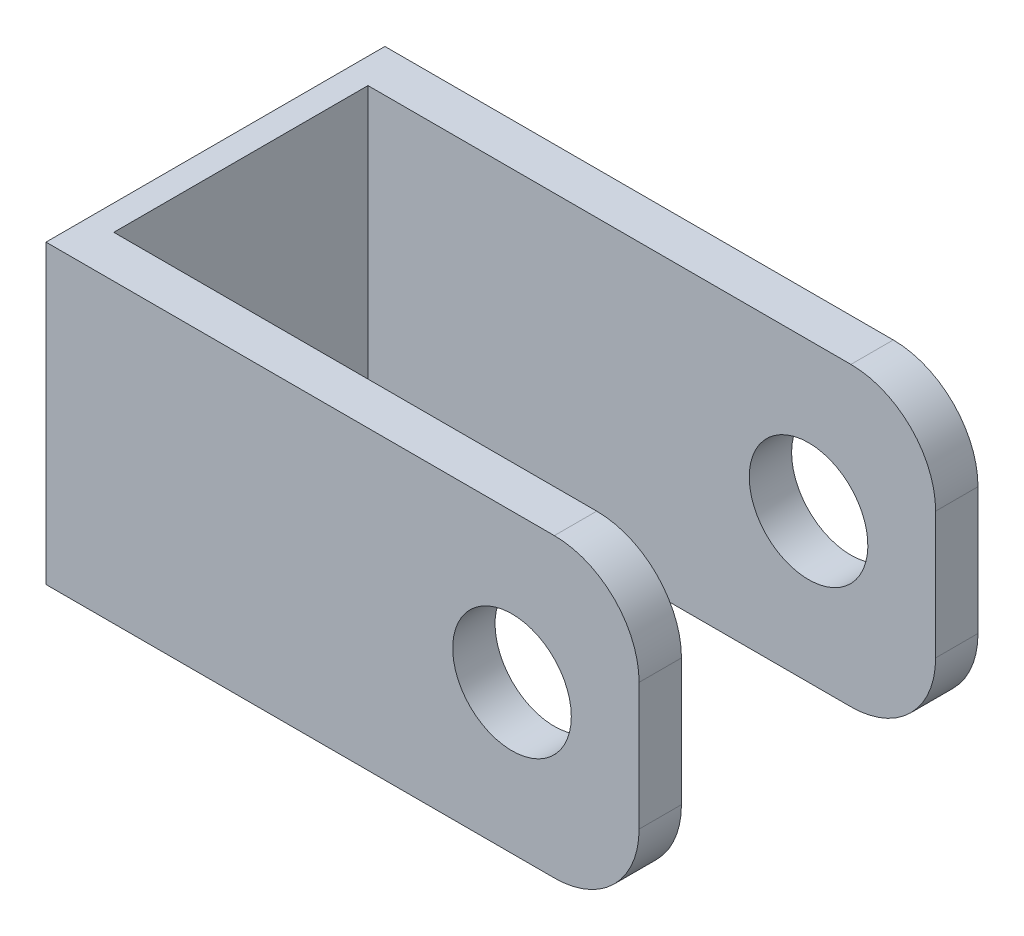
ISO-10303-21;
HEADER;
FILE_DESCRIPTION(('STEP AP214'),'2;1');
FILE_NAME('part.step','',(''),(''),'','','');
FILE_SCHEMA(('AUTOMOTIVE_DESIGN { 1 0 10303 214 1 1 1 1 }'));
ENDSEC;
DATA;
#1=APPLICATION_CONTEXT('core data for automotive mechanical design processes');
#2=APPLICATION_PROTOCOL_DEFINITION('international standard','automotive_design',2000,#1);
#3=PRODUCT_CONTEXT('',#1,'mechanical');
#4=PRODUCT('Part','Part','',(#3));
#5=PRODUCT_RELATED_PRODUCT_CATEGORY('part','',(#4));
#6=PRODUCT_DEFINITION_FORMATION('','',#4);
#7=PRODUCT_DEFINITION_CONTEXT('part definition',#1,'design');
#8=PRODUCT_DEFINITION('design','',#6,#7);
#9=PRODUCT_DEFINITION_SHAPE('','',#8);
#10=(LENGTH_UNIT() NAMED_UNIT(*) SI_UNIT(.MILLI.,.METRE.));
#11=(NAMED_UNIT(*) PLANE_ANGLE_UNIT() SI_UNIT($,.RADIAN.));
#12=(NAMED_UNIT(*) SI_UNIT($,.STERADIAN.) SOLID_ANGLE_UNIT());
#13=UNCERTAINTY_MEASURE_WITH_UNIT(LENGTH_MEASURE(1.E-05),#10,'distance_accuracy_value','');
#14=(GEOMETRIC_REPRESENTATION_CONTEXT(3) GLOBAL_UNCERTAINTY_ASSIGNED_CONTEXT((#13)) GLOBAL_UNIT_ASSIGNED_CONTEXT((#10,
#11,#12)) REPRESENTATION_CONTEXT('',''));
#15=CARTESIAN_POINT('',(0.,0.,0.));
#16=DIRECTION('',(0.,0.,1.));
#17=DIRECTION('',(1.,0.,0.));
#18=AXIS2_PLACEMENT_3D('',#15,#16,#17);
#19=CARTESIAN_POINT('',(3.,0.,0.));
#20=DIRECTION('',(1.,0.,0.));
#21=DIRECTION('',(0.,0.,-1.));
#22=AXIS2_PLACEMENT_3D('',#19,#20,#21);
#23=PLANE('',#22);
#24=DIRECTION('',(0.,0.,-1.));
#25=VECTOR('',#24,1.);
#26=CARTESIAN_POINT('',(3.,0.,0.));
#27=LINE('',#26,#25);
#28=CARTESIAN_POINT('',(3.,0.,35.));
#29=VERTEX_POINT('',#28);
#30=CARTESIAN_POINT('',(3.,0.,4.99999999999999));
#31=VERTEX_POINT('',#30);
#32=EDGE_CURVE('E131',#29,#31,#27,.T.);
#33=ORIENTED_EDGE('',*,*,#32,.T.);
#34=DIRECTION('',(0.,1.,0.));
#35=VECTOR('',#34,1.);
#36=CARTESIAN_POINT('',(3.,0.,4.99999999999999));
#37=LINE('',#36,#35);
#38=CARTESIAN_POINT('',(3.,35.,4.99999999999999));
#39=VERTEX_POINT('',#38);
#40=EDGE_CURVE('E139',#31,#39,#37,.T.);
#41=ORIENTED_EDGE('',*,*,#40,.T.);
#42=DIRECTION('',(0.,0.,1.));
#43=VECTOR('',#42,1.);
#44=CARTESIAN_POINT('',(3.,35.,0.));
#45=LINE('',#44,#43);
#46=CARTESIAN_POINT('',(3.,35.,35.));
#47=VERTEX_POINT('',#46);
#48=EDGE_CURVE('E152',#39,#47,#45,.T.);
#49=ORIENTED_EDGE('',*,*,#48,.T.);
#50=DIRECTION('',(0.,1.,0.));
#51=VECTOR('',#50,1.);
#52=CARTESIAN_POINT('',(3.,0.,35.));
#53=LINE('',#52,#51);
#54=EDGE_CURVE('E150',#29,#47,#53,.T.);
#55=ORIENTED_EDGE('',*,*,#54,.F.);
#56=EDGE_LOOP('',(#33,#41,#49,#55));
#57=FACE_BOUND('',#56,.T.);
#58=ADVANCED_FACE('F33',(#57),#23,.T.);
#59=CARTESIAN_POINT('',(3.,0.,0.));
#60=DIRECTION('',(0.,0.,1.));
#61=DIRECTION('',(0.,-1.,0.));
#62=AXIS2_PLACEMENT_3D('',#59,#60,#61);
#63=PLANE('',#62);
#64=CARTESIAN_POINT('',(55.,17.5,0.));
#65=DIRECTION('',(0.,0.,1.));
#66=DIRECTION('',(0.,-1.,0.));
#67=AXIS2_PLACEMENT_3D('',#64,#65,#66);
#68=CIRCLE('',#67,7.);
#69=CARTESIAN_POINT('',(55.,10.5,0.));
#70=VERTEX_POINT('',#69);
#71=EDGE_CURVE('E416',#70,#70,#68,.T.);
#72=ORIENTED_EDGE('',*,*,#71,.T.);
#73=EDGE_LOOP('',(#72));
#74=FACE_BOUND('',#73,.T.);
#75=DIRECTION('',(0.,-1.,0.));
#76=VECTOR('',#75,1.);
#77=CARTESIAN_POINT('',(70.,35.,0.));
#78=LINE('',#77,#76);
#79=CARTESIAN_POINT('',(70.,25.,0.));
#80=VERTEX_POINT('',#79);
#81=CARTESIAN_POINT('',(70.,10.,0.));
#82=VERTEX_POINT('',#81);
#83=EDGE_CURVE('E135',#80,#82,#78,.T.);
#84=ORIENTED_EDGE('',*,*,#83,.T.);
#85=CARTESIAN_POINT('',(60.,10.,0.));
#86=DIRECTION('',(0.,0.,1.));
#87=DIRECTION('',(0.,-1.,0.));
#88=AXIS2_PLACEMENT_3D('',#85,#86,#87);
#89=CIRCLE('',#88,10.);
#90=CARTESIAN_POINT('',(60.,0.,0.));
#91=VERTEX_POINT('',#90);
#92=EDGE_CURVE('E190',#82,#91,#89,.F.);
#93=ORIENTED_EDGE('',*,*,#92,.T.);
#94=DIRECTION('',(-1.,0.,0.));
#95=VECTOR('',#94,1.);
#96=CARTESIAN_POINT('',(3.,0.,0.));
#97=LINE('',#96,#95);
#98=CARTESIAN_POINT('',(0.,0.,0.));
#99=VERTEX_POINT('',#98);
#100=EDGE_CURVE('E151',#91,#99,#97,.T.);
#101=ORIENTED_EDGE('',*,*,#100,.T.);
#102=DIRECTION('',(0.,1.,0.));
#103=VECTOR('',#102,1.);
#104=CARTESIAN_POINT('',(0.,0.,0.));
#105=LINE('',#104,#103);
#106=CARTESIAN_POINT('',(0.,35.,0.));
#107=VERTEX_POINT('',#106);
#108=EDGE_CURVE('E160',#99,#107,#105,.T.);
#109=ORIENTED_EDGE('',*,*,#108,.T.);
#110=DIRECTION('',(-1.,0.,0.));
#111=VECTOR('',#110,1.);
#112=CARTESIAN_POINT('',(3.,35.,0.));
#113=LINE('',#112,#111);
#114=CARTESIAN_POINT('',(60.,35.,0.));
#115=VERTEX_POINT('',#114);
#116=EDGE_CURVE('E174',#115,#107,#113,.T.);
#117=ORIENTED_EDGE('',*,*,#116,.F.);
#118=CARTESIAN_POINT('',(60.,25.,0.));
#119=DIRECTION('',(0.,0.,1.));
#120=DIRECTION('',(0.,-1.,0.));
#121=AXIS2_PLACEMENT_3D('',#118,#119,#120);
#122=CIRCLE('',#121,10.);
#123=EDGE_CURVE('E188',#115,#80,#122,.F.);
#124=ORIENTED_EDGE('',*,*,#123,.T.);
#125=EDGE_LOOP('',(#84,#93,#101,#109,#117,#124));
#126=FACE_BOUND('',#125,.T.);
#127=ADVANCED_FACE('F212',(#74,#126),#63,.F.);
#128=CARTESIAN_POINT('',(3.,35.,0.));
#129=DIRECTION('',(0.,-1.,0.));
#130=DIRECTION('',(0.,0.,-1.));
#131=AXIS2_PLACEMENT_3D('',#128,#129,#130);
#132=PLANE('',#131);
#133=DIRECTION('',(-1.,0.,0.));
#134=VECTOR('',#133,1.);
#135=CARTESIAN_POINT('',(3.,35.,40.));
#136=LINE('',#135,#134);
#137=CARTESIAN_POINT('',(60.,35.,40.));
#138=VERTEX_POINT('',#137);
#139=CARTESIAN_POINT('',(0.,35.,40.));
#140=VERTEX_POINT('',#139);
#141=EDGE_CURVE('E172',#138,#140,#136,.T.);
#142=ORIENTED_EDGE('',*,*,#141,.F.);
#143=DIRECTION('',(0.,0.,-1.));
#144=VECTOR('',#143,1.);
#145=CARTESIAN_POINT('',(60.,35.,0.));
#146=LINE('',#145,#144);
#147=CARTESIAN_POINT('',(60.,35.,35.));
#148=VERTEX_POINT('',#147);
#149=EDGE_CURVE('E11',#138,#148,#146,.T.);
#150=ORIENTED_EDGE('',*,*,#149,.T.);
#151=DIRECTION('',(-1.,0.,0.));
#152=VECTOR('',#151,1.);
#153=CARTESIAN_POINT('',(70.,35.,35.));
#154=LINE('',#153,#152);
#155=EDGE_CURVE('E230',#148,#47,#154,.T.);
#156=ORIENTED_EDGE('',*,*,#155,.T.);
#157=ORIENTED_EDGE('',*,*,#48,.F.);
#158=DIRECTION('',(-1.,0.,0.));
#159=VECTOR('',#158,1.);
#160=CARTESIAN_POINT('',(70.,35.,5.));
#161=LINE('',#160,#159);
#162=CARTESIAN_POINT('',(60.,35.,5.));
#163=VERTEX_POINT('',#162);
#164=EDGE_CURVE('E136',#163,#39,#161,.T.);
#165=ORIENTED_EDGE('',*,*,#164,.F.);
#166=DIRECTION('',(0.,0.,1.));
#167=VECTOR('',#166,1.);
#168=CARTESIAN_POINT('',(60.,35.,0.));
#169=LINE('',#168,#167);
#170=EDGE_CURVE('E42',#163,#115,#169,.F.);
#171=ORIENTED_EDGE('',*,*,#170,.T.);
#172=ORIENTED_EDGE('',*,*,#116,.T.);
#173=DIRECTION('',(0.,0.,1.));
#174=VECTOR('',#173,1.);
#175=CARTESIAN_POINT('',(0.,35.,0.));
#176=LINE('',#175,#174);
#177=EDGE_CURVE('E163',#107,#140,#176,.T.);
#178=ORIENTED_EDGE('',*,*,#177,.T.);
#179=EDGE_LOOP('',(#142,#150,#156,#157,#165,#171,#172,#178));
#180=FACE_BOUND('',#179,.T.);
#181=ADVANCED_FACE('F206',(#180),#132,.F.);
#182=CARTESIAN_POINT('',(3.,0.,40.));
#183=DIRECTION('',(0.,0.,-1.));
#184=DIRECTION('',(-1.,0.,0.));
#185=AXIS2_PLACEMENT_3D('',#182,#183,#184);
#186=PLANE('',#185);
#187=CARTESIAN_POINT('',(55.,17.5,40.));
#188=DIRECTION('',(0.,0.,1.));
#189=DIRECTION('',(1.,0.,0.));
#190=AXIS2_PLACEMENT_3D('',#187,#188,#189);
#191=CIRCLE('',#190,7.);
#192=CARTESIAN_POINT('',(62.,17.5,40.));
#193=VERTEX_POINT('',#192);
#194=EDGE_CURVE('E411',#193,#193,#191,.T.);
#195=ORIENTED_EDGE('',*,*,#194,.F.);
#196=EDGE_LOOP('',(#195));
#197=FACE_BOUND('',#196,.T.);
#198=DIRECTION('',(-1.,0.,0.));
#199=VECTOR('',#198,1.);
#200=CARTESIAN_POINT('',(3.,0.,40.));
#201=LINE('',#200,#199);
#202=CARTESIAN_POINT('',(60.,0.,40.));
#203=VERTEX_POINT('',#202);
#204=CARTESIAN_POINT('',(0.,0.,40.));
#205=VERTEX_POINT('',#204);
#206=EDGE_CURVE('E154',#203,#205,#201,.T.);
#207=ORIENTED_EDGE('',*,*,#206,.F.);
#208=CARTESIAN_POINT('',(60.,10.,40.));
#209=DIRECTION('',(0.,0.,-1.));
#210=DIRECTION('',(-1.,0.,0.));
#211=AXIS2_PLACEMENT_3D('',#208,#209,#210);
#212=CIRCLE('',#211,10.);
#213=CARTESIAN_POINT('',(70.,9.99999999999999,40.));
#214=VERTEX_POINT('',#213);
#215=EDGE_CURVE('E201',#203,#214,#212,.F.);
#216=ORIENTED_EDGE('',*,*,#215,.T.);
#217=DIRECTION('',(0.,-1.,0.));
#218=VECTOR('',#217,1.);
#219=CARTESIAN_POINT('',(70.,35.,40.));
#220=LINE('',#219,#218);
#221=CARTESIAN_POINT('',(70.,25.,40.));
#222=VERTEX_POINT('',#221);
#223=EDGE_CURVE('E227',#222,#214,#220,.T.);
#224=ORIENTED_EDGE('',*,*,#223,.F.);
#225=CARTESIAN_POINT('',(60.,25.,40.));
#226=DIRECTION('',(0.,0.,-1.));
#227=DIRECTION('',(-1.,0.,0.));
#228=AXIS2_PLACEMENT_3D('',#225,#226,#227);
#229=CIRCLE('',#228,10.);
#230=EDGE_CURVE('E49',#222,#138,#229,.F.);
#231=ORIENTED_EDGE('',*,*,#230,.T.);
#232=ORIENTED_EDGE('',*,*,#141,.T.);
#233=DIRECTION('',(0.,-1.,0.));
#234=VECTOR('',#233,1.);
#235=CARTESIAN_POINT('',(0.,0.,40.));
#236=LINE('',#235,#234);
#237=EDGE_CURVE('E166',#140,#205,#236,.T.);
#238=ORIENTED_EDGE('',*,*,#237,.T.);
#239=EDGE_LOOP('',(#207,#216,#224,#231,#232,#238));
#240=FACE_BOUND('',#239,.T.);
#241=ADVANCED_FACE('F242',(#197,#240),#186,.F.);
#242=CARTESIAN_POINT('',(3.,0.,0.));
#243=DIRECTION('',(0.,1.,0.));
#244=DIRECTION('',(0.,0.,1.));
#245=AXIS2_PLACEMENT_3D('',#242,#243,#244);
#246=PLANE('',#245);
#247=ORIENTED_EDGE('',*,*,#100,.F.);
#248=DIRECTION('',(0.,0.,1.));
#249=VECTOR('',#248,1.);
#250=CARTESIAN_POINT('',(60.,0.,4.99999999999999));
#251=LINE('',#250,#249);
#252=CARTESIAN_POINT('',(60.,0.,4.99999999999999));
#253=VERTEX_POINT('',#252);
#254=EDGE_CURVE('E133',#91,#253,#251,.T.);
#255=ORIENTED_EDGE('',*,*,#254,.T.);
#256=DIRECTION('',(-1.,0.,0.));
#257=VECTOR('',#256,1.);
#258=CARTESIAN_POINT('',(70.,0.,4.99999999999999));
#259=LINE('',#258,#257);
#260=EDGE_CURVE('E125',#253,#31,#259,.T.);
#261=ORIENTED_EDGE('',*,*,#260,.T.);
#262=ORIENTED_EDGE('',*,*,#32,.F.);
#263=DIRECTION('',(-1.,0.,0.));
#264=VECTOR('',#263,1.);
#265=CARTESIAN_POINT('',(70.,0.,35.));
#266=LINE('',#265,#264);
#267=CARTESIAN_POINT('',(60.,0.,35.));
#268=VERTEX_POINT('',#267);
#269=EDGE_CURVE('E232',#268,#29,#266,.T.);
#270=ORIENTED_EDGE('',*,*,#269,.F.);
#271=DIRECTION('',(0.,0.,-1.));
#272=VECTOR('',#271,1.);
#273=CARTESIAN_POINT('',(60.,0.,0.));
#274=LINE('',#273,#272);
#275=EDGE_CURVE('E176',#268,#203,#274,.F.);
#276=ORIENTED_EDGE('',*,*,#275,.T.);
#277=ORIENTED_EDGE('',*,*,#206,.T.);
#278=DIRECTION('',(0.,0.,-1.));
#279=VECTOR('',#278,1.);
#280=CARTESIAN_POINT('',(0.,0.,0.));
#281=LINE('',#280,#279);
#282=EDGE_CURVE('E156',#205,#99,#281,.T.);
#283=ORIENTED_EDGE('',*,*,#282,.T.);
#284=EDGE_LOOP('',(#247,#255,#261,#262,#270,#276,#277,#283));
#285=FACE_BOUND('',#284,.T.);
#286=ADVANCED_FACE('F128',(#285),#246,.F.);
#287=CARTESIAN_POINT('',(0.,0.,0.));
#288=DIRECTION('',(1.,0.,0.));
#289=DIRECTION('',(0.,0.,-1.));
#290=AXIS2_PLACEMENT_3D('',#287,#288,#289);
#291=PLANE('',#290);
#292=ORIENTED_EDGE('',*,*,#108,.F.);
#293=ORIENTED_EDGE('',*,*,#282,.F.);
#294=ORIENTED_EDGE('',*,*,#237,.F.);
#295=ORIENTED_EDGE('',*,*,#177,.F.);
#296=EDGE_LOOP('',(#292,#293,#294,#295));
#297=FACE_BOUND('',#296,.T.);
#298=ADVANCED_FACE('F250',(#297),#291,.F.);
#299=CARTESIAN_POINT('',(70.,35.,35.));
#300=DIRECTION('',(0.,0.,-1.));
#301=DIRECTION('',(0.,1.,0.));
#302=AXIS2_PLACEMENT_3D('',#299,#300,#301);
#303=PLANE('',#302);
#304=CARTESIAN_POINT('',(55.,17.5,35.));
#305=DIRECTION('',(0.,0.,-1.));
#306=DIRECTION('',(0.,1.,0.));
#307=AXIS2_PLACEMENT_3D('',#304,#305,#306);
#308=CIRCLE('',#307,7.);
#309=CARTESIAN_POINT('',(55.,24.5,35.));
#310=VERTEX_POINT('',#309);
#311=EDGE_CURVE('E408',#310,#310,#308,.T.);
#312=ORIENTED_EDGE('',*,*,#311,.F.);
#313=EDGE_LOOP('',(#312));
#314=FACE_BOUND('',#313,.T.);
#315=DIRECTION('',(0.,-1.,0.));
#316=VECTOR('',#315,1.);
#317=CARTESIAN_POINT('',(70.,35.,35.));
#318=LINE('',#317,#316);
#319=CARTESIAN_POINT('',(70.,25.,35.));
#320=VERTEX_POINT('',#319);
#321=CARTESIAN_POINT('',(70.,9.99999999999999,35.));
#322=VERTEX_POINT('',#321);
#323=EDGE_CURVE('E145',#320,#322,#318,.T.);
#324=ORIENTED_EDGE('',*,*,#323,.T.);
#325=CARTESIAN_POINT('',(60.,10.,35.));
#326=DIRECTION('',(0.,0.,-1.));
#327=DIRECTION('',(0.,1.,0.));
#328=AXIS2_PLACEMENT_3D('',#325,#326,#327);
#329=CIRCLE('',#328,10.);
#330=EDGE_CURVE('E198',#322,#268,#329,.T.);
#331=ORIENTED_EDGE('',*,*,#330,.T.);
#332=ORIENTED_EDGE('',*,*,#269,.T.);
#333=ORIENTED_EDGE('',*,*,#54,.T.);
#334=ORIENTED_EDGE('',*,*,#155,.F.);
#335=CARTESIAN_POINT('',(60.,25.,35.));
#336=DIRECTION('',(0.,0.,-1.));
#337=DIRECTION('',(0.,1.,0.));
#338=AXIS2_PLACEMENT_3D('',#335,#336,#337);
#339=CIRCLE('',#338,10.);
#340=EDGE_CURVE('E57',#148,#320,#339,.T.);
#341=ORIENTED_EDGE('',*,*,#340,.T.);
#342=EDGE_LOOP('',(#324,#331,#332,#333,#334,#341));
#343=FACE_BOUND('',#342,.T.);
#344=ADVANCED_FACE('F235',(#314,#343),#303,.T.);
#345=CARTESIAN_POINT('',(70.,0.,0.));
#346=DIRECTION('',(-1.,0.,0.));
#347=DIRECTION('',(0.,0.,1.));
#348=AXIS2_PLACEMENT_3D('',#345,#346,#347);
#349=PLANE('',#348);
#350=ORIENTED_EDGE('',*,*,#223,.T.);
#351=DIRECTION('',(0.,0.,-1.));
#352=VECTOR('',#351,1.);
#353=CARTESIAN_POINT('',(70.,10.,0.));
#354=LINE('',#353,#352);
#355=EDGE_CURVE('E194',#214,#322,#354,.T.);
#356=ORIENTED_EDGE('',*,*,#355,.T.);
#357=ORIENTED_EDGE('',*,*,#323,.F.);
#358=DIRECTION('',(0.,0.,-1.));
#359=VECTOR('',#358,1.);
#360=CARTESIAN_POINT('',(70.,25.,0.));
#361=LINE('',#360,#359);
#362=EDGE_CURVE('E192',#320,#222,#361,.F.);
#363=ORIENTED_EDGE('',*,*,#362,.T.);
#364=EDGE_LOOP('',(#350,#356,#357,#363));
#365=FACE_BOUND('',#364,.T.);
#366=ADVANCED_FACE('F244',(#365),#349,.F.);
#367=CARTESIAN_POINT('',(70.,35.,5.));
#368=DIRECTION('',(0.,0.,-1.));
#369=DIRECTION('',(0.,1.,0.));
#370=AXIS2_PLACEMENT_3D('',#367,#368,#369);
#371=PLANE('',#370);
#372=CARTESIAN_POINT('',(55.,17.5,5.));
#373=DIRECTION('',(0.,0.,-1.));
#374=DIRECTION('',(0.,1.,0.));
#375=AXIS2_PLACEMENT_3D('',#372,#373,#374);
#376=CIRCLE('',#375,7.);
#377=CARTESIAN_POINT('',(55.,24.5,5.00000000000001));
#378=VERTEX_POINT('',#377);
#379=EDGE_CURVE('E37',#378,#378,#376,.T.);
#380=ORIENTED_EDGE('',*,*,#379,.T.);
#381=EDGE_LOOP('',(#380));
#382=FACE_BOUND('',#381,.T.);
#383=ORIENTED_EDGE('',*,*,#260,.F.);
#384=CARTESIAN_POINT('',(60.,10.,4.99999999999999));
#385=DIRECTION('',(0.,0.,-1.));
#386=DIRECTION('',(0.,1.,0.));
#387=AXIS2_PLACEMENT_3D('',#384,#385,#386);
#388=CIRCLE('',#387,10.);
#389=CARTESIAN_POINT('',(70.,10.,4.99999999999999));
#390=VERTEX_POINT('',#389);
#391=EDGE_CURVE('E181',#253,#390,#388,.F.);
#392=ORIENTED_EDGE('',*,*,#391,.T.);
#393=DIRECTION('',(0.,-1.,0.));
#394=VECTOR('',#393,1.);
#395=CARTESIAN_POINT('',(70.,35.,5.));
#396=LINE('',#395,#394);
#397=CARTESIAN_POINT('',(70.,25.,5.));
#398=VERTEX_POINT('',#397);
#399=EDGE_CURVE('E146',#398,#390,#396,.T.);
#400=ORIENTED_EDGE('',*,*,#399,.F.);
#401=CARTESIAN_POINT('',(60.,25.,5.));
#402=DIRECTION('',(0.,0.,-1.));
#403=DIRECTION('',(0.,1.,0.));
#404=AXIS2_PLACEMENT_3D('',#401,#402,#403);
#405=CIRCLE('',#404,10.);
#406=EDGE_CURVE('E179',#398,#163,#405,.F.);
#407=ORIENTED_EDGE('',*,*,#406,.T.);
#408=ORIENTED_EDGE('',*,*,#164,.T.);
#409=ORIENTED_EDGE('',*,*,#40,.F.);
#410=EDGE_LOOP('',(#383,#392,#400,#407,#408,#409));
#411=FACE_BOUND('',#410,.T.);
#412=ADVANCED_FACE('F140',(#382,#411),#371,.F.);
#413=CARTESIAN_POINT('',(70.,0.,0.));
#414=DIRECTION('',(1.,0.,0.));
#415=DIRECTION('',(0.,0.,-1.));
#416=AXIS2_PLACEMENT_3D('',#413,#414,#415);
#417=PLANE('',#416);
#418=ORIENTED_EDGE('',*,*,#399,.T.);
#419=DIRECTION('',(0.,0.,1.));
#420=VECTOR('',#419,1.);
#421=CARTESIAN_POINT('',(70.,10.,0.));
#422=LINE('',#421,#420);
#423=EDGE_CURVE('E186',#390,#82,#422,.F.);
#424=ORIENTED_EDGE('',*,*,#423,.T.);
#425=ORIENTED_EDGE('',*,*,#83,.F.);
#426=DIRECTION('',(0.,0.,1.));
#427=VECTOR('',#426,1.);
#428=CARTESIAN_POINT('',(70.,25.,5.));
#429=LINE('',#428,#427);
#430=EDGE_CURVE('E183',#80,#398,#429,.T.);
#431=ORIENTED_EDGE('',*,*,#430,.T.);
#432=EDGE_LOOP('',(#418,#424,#425,#431));
#433=FACE_BOUND('',#432,.T.);
#434=ADVANCED_FACE('F219',(#433),#417,.T.);
#435=CARTESIAN_POINT('',(60.,10.,0.));
#436=DIRECTION('',(0.,0.,-1.));
#437=DIRECTION('',(0.,1.,0.));
#438=AXIS2_PLACEMENT_3D('',#435,#436,#437);
#439=CYLINDRICAL_SURFACE('',#438,10.);
#440=ORIENTED_EDGE('',*,*,#92,.F.);
#441=ORIENTED_EDGE('',*,*,#423,.F.);
#442=ORIENTED_EDGE('',*,*,#391,.F.);
#443=ORIENTED_EDGE('',*,*,#254,.F.);
#444=EDGE_LOOP('',(#440,#441,#442,#443));
#445=FACE_BOUND('',#444,.T.);
#446=ADVANCED_FACE('F253',(#445),#439,.T.);
#447=CARTESIAN_POINT('',(60.,10.,0.));
#448=DIRECTION('',(0.,0.,-1.));
#449=DIRECTION('',(0.,1.,0.));
#450=AXIS2_PLACEMENT_3D('',#447,#448,#449);
#451=CYLINDRICAL_SURFACE('',#450,10.);
#452=ORIENTED_EDGE('',*,*,#215,.F.);
#453=ORIENTED_EDGE('',*,*,#275,.F.);
#454=ORIENTED_EDGE('',*,*,#330,.F.);
#455=ORIENTED_EDGE('',*,*,#355,.F.);
#456=EDGE_LOOP('',(#452,#453,#454,#455));
#457=FACE_BOUND('',#456,.T.);
#458=ADVANCED_FACE('F240',(#457),#451,.T.);
#459=CARTESIAN_POINT('',(60.,25.,0.));
#460=DIRECTION('',(0.,0.,-1.));
#461=DIRECTION('',(-1.,0.,0.));
#462=AXIS2_PLACEMENT_3D('',#459,#460,#461);
#463=CYLINDRICAL_SURFACE('',#462,10.);
#464=ORIENTED_EDGE('',*,*,#230,.F.);
#465=ORIENTED_EDGE('',*,*,#362,.F.);
#466=ORIENTED_EDGE('',*,*,#340,.F.);
#467=ORIENTED_EDGE('',*,*,#149,.F.);
#468=EDGE_LOOP('',(#464,#465,#466,#467));
#469=FACE_BOUND('',#468,.T.);
#470=ADVANCED_FACE('F246',(#469),#463,.T.);
#471=CARTESIAN_POINT('',(60.,25.,0.));
#472=DIRECTION('',(0.,0.,-1.));
#473=DIRECTION('',(-1.,0.,0.));
#474=AXIS2_PLACEMENT_3D('',#471,#472,#473);
#475=CYLINDRICAL_SURFACE('',#474,10.);
#476=ORIENTED_EDGE('',*,*,#123,.F.);
#477=ORIENTED_EDGE('',*,*,#170,.F.);
#478=ORIENTED_EDGE('',*,*,#406,.F.);
#479=ORIENTED_EDGE('',*,*,#430,.F.);
#480=EDGE_LOOP('',(#476,#477,#478,#479));
#481=FACE_BOUND('',#480,.T.);
#482=ADVANCED_FACE('F35',(#481),#475,.T.);
#483=CARTESIAN_POINT('',(55.,17.5,-80.));
#484=DIRECTION('',(0.,0.,1.));
#485=DIRECTION('',(1.,0.,0.));
#486=AXIS2_PLACEMENT_3D('',#483,#484,#485);
#487=CYLINDRICAL_SURFACE('',#486,7.);
#488=ORIENTED_EDGE('',*,*,#379,.F.);
#489=EDGE_LOOP('',(#488));
#490=FACE_BOUND('',#489,.T.);
#491=ORIENTED_EDGE('',*,*,#71,.F.);
#492=EDGE_LOOP('',(#491));
#493=FACE_BOUND('',#492,.T.);
#494=ADVANCED_FACE('F344',(#490,#493),#487,.F.);
#495=ORIENTED_EDGE('',*,*,#311,.T.);
#496=EDGE_LOOP('',(#495));
#497=FACE_BOUND('',#496,.T.);
#498=ORIENTED_EDGE('',*,*,#194,.T.);
#499=EDGE_LOOP('',(#498));
#500=FACE_BOUND('',#499,.T.);
#501=ADVANCED_FACE('F392',(#497,#500),#487,.F.);
#502=CLOSED_SHELL('',(#58,#127,#181,#241,#286,#298,#344,#366,#412,#434,#446,#458,#470,#482,#494,#501));
#503=MANIFOLD_SOLID_BREP('B2',#502);
#504=ADVANCED_BREP_SHAPE_REPRESENTATION('',(#18,#503),#14);
#505=SHAPE_DEFINITION_REPRESENTATION(#9,#504);
ENDSEC;
END-ISO-10303-21;
